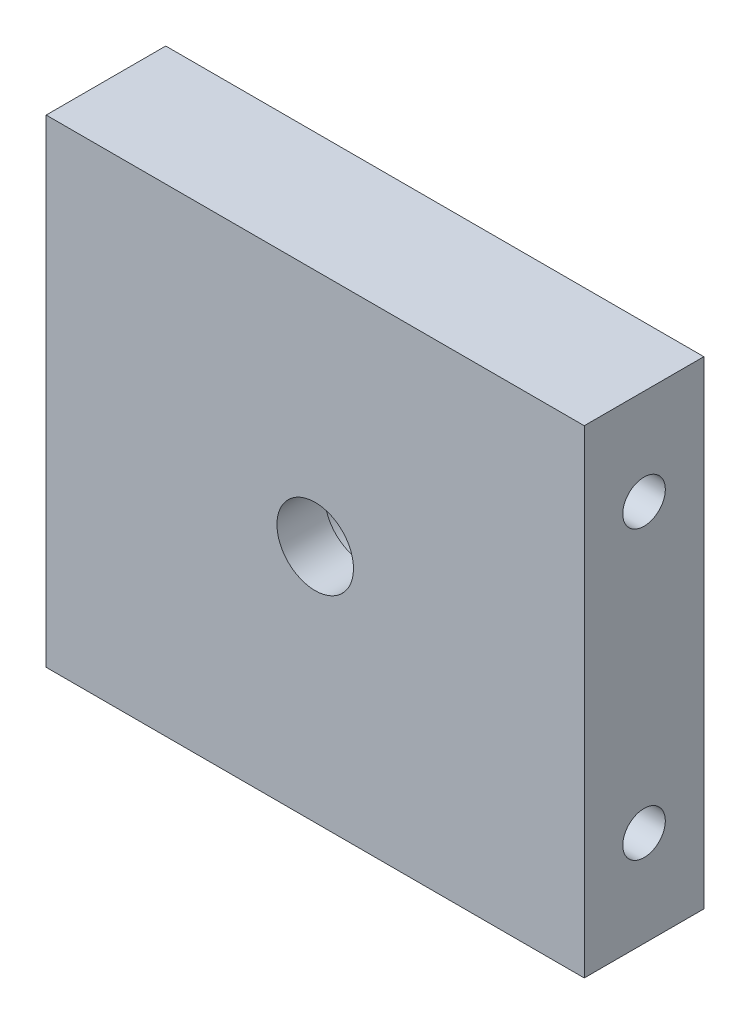
ISO-10303-21;
HEADER;
FILE_DESCRIPTION(('STEP AP214'),'2;1');
FILE_NAME('part.step','',(''),(''),'','','');
FILE_SCHEMA(('AUTOMOTIVE_DESIGN { 1 0 10303 214 1 1 1 1 }'));
ENDSEC;
DATA;
#1=APPLICATION_CONTEXT('core data for automotive mechanical design processes');
#2=APPLICATION_PROTOCOL_DEFINITION('international standard','automotive_design',2000,#1);
#3=PRODUCT_CONTEXT('',#1,'mechanical');
#4=PRODUCT('Part','Part','',(#3));
#5=PRODUCT_RELATED_PRODUCT_CATEGORY('part','',(#4));
#6=PRODUCT_DEFINITION_FORMATION('','',#4);
#7=PRODUCT_DEFINITION_CONTEXT('part definition',#1,'design');
#8=PRODUCT_DEFINITION('design','',#6,#7);
#9=PRODUCT_DEFINITION_SHAPE('','',#8);
#10=(LENGTH_UNIT() NAMED_UNIT(*) SI_UNIT(.MILLI.,.METRE.));
#11=(NAMED_UNIT(*) PLANE_ANGLE_UNIT() SI_UNIT($,.RADIAN.));
#12=(NAMED_UNIT(*) SI_UNIT($,.STERADIAN.) SOLID_ANGLE_UNIT());
#13=UNCERTAINTY_MEASURE_WITH_UNIT(LENGTH_MEASURE(1.E-05),#10,'distance_accuracy_value','');
#14=(GEOMETRIC_REPRESENTATION_CONTEXT(3) GLOBAL_UNCERTAINTY_ASSIGNED_CONTEXT((#13)) GLOBAL_UNIT_ASSIGNED_CONTEXT((#10,
#11,#12)) REPRESENTATION_CONTEXT('',''));
#15=CARTESIAN_POINT('',(0.,0.,0.));
#16=DIRECTION('',(0.,0.,1.));
#17=DIRECTION('',(1.,0.,0.));
#18=AXIS2_PLACEMENT_3D('',#15,#16,#17);
#19=CARTESIAN_POINT('',(14.2875,-12.7,6.35));
#20=DIRECTION('',(-1.,0.,0.));
#21=DIRECTION('',(0.,0.,1.));
#22=AXIS2_PLACEMENT_3D('',#19,#20,#21);
#23=PLANE('',#22);
#24=DIRECTION('',(0.,1.,0.));
#25=VECTOR('',#24,1.);
#26=CARTESIAN_POINT('',(14.2875,-12.7,0.));
#27=LINE('',#26,#25);
#28=CARTESIAN_POINT('',(14.2875,-12.7,0.));
#29=VERTEX_POINT('',#28);
#30=CARTESIAN_POINT('',(14.2875,12.7,0.));
#31=VERTEX_POINT('',#30);
#32=EDGE_CURVE('E132',#29,#31,#27,.T.);
#33=ORIENTED_EDGE('',*,*,#32,.T.);
#34=DIRECTION('',(0.,0.,-1.));
#35=VECTOR('',#34,1.);
#36=CARTESIAN_POINT('',(14.2875,12.7,6.35));
#37=LINE('',#36,#35);
#38=CARTESIAN_POINT('',(14.2875,12.7,6.35));
#39=VERTEX_POINT('',#38);
#40=EDGE_CURVE('E11',#39,#31,#37,.T.);
#41=ORIENTED_EDGE('',*,*,#40,.F.);
#42=DIRECTION('',(0.,1.,0.));
#43=VECTOR('',#42,1.);
#44=CARTESIAN_POINT('',(14.2875,-12.7,6.35));
#45=LINE('',#44,#43);
#46=CARTESIAN_POINT('',(14.2875,-12.7,6.35));
#47=VERTEX_POINT('',#46);
#48=EDGE_CURVE('E133',#47,#39,#45,.T.);
#49=ORIENTED_EDGE('',*,*,#48,.F.);
#50=DIRECTION('',(0.,0.,-1.));
#51=VECTOR('',#50,1.);
#52=CARTESIAN_POINT('',(14.2875,-12.7,6.35));
#53=LINE('',#52,#51);
#54=EDGE_CURVE('E139',#47,#29,#53,.T.);
#55=ORIENTED_EDGE('',*,*,#54,.T.);
#56=EDGE_LOOP('',(#33,#41,#49,#55));
#57=FACE_BOUND('',#56,.T.);
#58=CARTESIAN_POINT('',(14.2875,-7.62,3.175));
#59=DIRECTION('',(1.,0.,0.));
#60=DIRECTION('',(0.,0.,-1.));
#61=AXIS2_PLACEMENT_3D('',#58,#59,#60);
#62=CIRCLE('',#61,1.1303);
#63=CARTESIAN_POINT('',(14.2875,-7.62,2.0447));
#64=VERTEX_POINT('',#63);
#65=EDGE_CURVE('E126',#64,#64,#62,.T.);
#66=ORIENTED_EDGE('',*,*,#65,.F.);
#67=EDGE_LOOP('',(#66));
#68=FACE_BOUND('',#67,.T.);
#69=CARTESIAN_POINT('',(14.2875,7.62,3.175));
#70=DIRECTION('',(1.,0.,0.));
#71=DIRECTION('',(0.,0.,-1.));
#72=AXIS2_PLACEMENT_3D('',#69,#70,#71);
#73=CIRCLE('',#72,1.1303);
#74=CARTESIAN_POINT('',(14.2875,7.62,2.0447));
#75=VERTEX_POINT('',#74);
#76=EDGE_CURVE('E120',#75,#75,#73,.T.);
#77=ORIENTED_EDGE('',*,*,#76,.F.);
#78=EDGE_LOOP('',(#77));
#79=FACE_BOUND('',#78,.T.);
#80=ADVANCED_FACE('F37',(#57,#68,#79),#23,.F.);
#81=CARTESIAN_POINT('',(-14.2875,12.7,6.35));
#82=DIRECTION('',(0.,-1.,0.));
#83=DIRECTION('',(0.,0.,-1.));
#84=AXIS2_PLACEMENT_3D('',#81,#82,#83);
#85=PLANE('',#84);
#86=DIRECTION('',(-1.,0.,0.));
#87=VECTOR('',#86,1.);
#88=CARTESIAN_POINT('',(-14.2875,12.7,0.));
#89=LINE('',#88,#87);
#90=CARTESIAN_POINT('',(-14.2875,12.7,0.));
#91=VERTEX_POINT('',#90);
#92=EDGE_CURVE('E142',#31,#91,#89,.T.);
#93=ORIENTED_EDGE('',*,*,#92,.T.);
#94=DIRECTION('',(0.,0.,-1.));
#95=VECTOR('',#94,1.);
#96=CARTESIAN_POINT('',(-14.2875,12.7,6.35));
#97=LINE('',#96,#95);
#98=CARTESIAN_POINT('',(-14.2875,12.7,6.35));
#99=VERTEX_POINT('',#98);
#100=EDGE_CURVE('E45',#99,#91,#97,.T.);
#101=ORIENTED_EDGE('',*,*,#100,.F.);
#102=DIRECTION('',(-1.,0.,0.));
#103=VECTOR('',#102,1.);
#104=CARTESIAN_POINT('',(-14.2875,12.7,6.35));
#105=LINE('',#104,#103);
#106=EDGE_CURVE('E84',#39,#99,#105,.T.);
#107=ORIENTED_EDGE('',*,*,#106,.F.);
#108=ORIENTED_EDGE('',*,*,#40,.T.);
#109=EDGE_LOOP('',(#93,#101,#107,#108));
#110=FACE_BOUND('',#109,.T.);
#111=ADVANCED_FACE('F167',(#110),#85,.F.);
#112=CARTESIAN_POINT('',(-14.2875,-12.7,6.35));
#113=DIRECTION('',(1.,0.,0.));
#114=DIRECTION('',(0.,0.,-1.));
#115=AXIS2_PLACEMENT_3D('',#112,#113,#114);
#116=PLANE('',#115);
#117=CARTESIAN_POINT('',(-14.2875,7.62,3.175));
#118=DIRECTION('',(-1.,0.,0.));
#119=DIRECTION('',(0.,0.,1.));
#120=AXIS2_PLACEMENT_3D('',#117,#118,#119);
#121=CIRCLE('',#120,1.1303);
#122=CARTESIAN_POINT('',(-14.2875,7.62,4.3053));
#123=VERTEX_POINT('',#122);
#124=EDGE_CURVE('E108',#123,#123,#121,.T.);
#125=ORIENTED_EDGE('',*,*,#124,.F.);
#126=EDGE_LOOP('',(#125));
#127=FACE_BOUND('',#126,.T.);
#128=CARTESIAN_POINT('',(-14.2875,-7.62,3.175));
#129=DIRECTION('',(-1.,0.,0.));
#130=DIRECTION('',(0.,0.,1.));
#131=AXIS2_PLACEMENT_3D('',#128,#129,#130);
#132=CIRCLE('',#131,1.1303);
#133=CARTESIAN_POINT('',(-14.2875,-7.62,4.3053));
#134=VERTEX_POINT('',#133);
#135=EDGE_CURVE('E107',#134,#134,#132,.T.);
#136=ORIENTED_EDGE('',*,*,#135,.F.);
#137=EDGE_LOOP('',(#136));
#138=FACE_BOUND('',#137,.T.);
#139=DIRECTION('',(0.,-1.,0.));
#140=VECTOR('',#139,1.);
#141=CARTESIAN_POINT('',(-14.2875,-12.7,0.));
#142=LINE('',#141,#140);
#143=CARTESIAN_POINT('',(-14.2875,-12.7,0.));
#144=VERTEX_POINT('',#143);
#145=EDGE_CURVE('E71',#91,#144,#142,.T.);
#146=ORIENTED_EDGE('',*,*,#145,.T.);
#147=DIRECTION('',(0.,0.,-1.));
#148=VECTOR('',#147,1.);
#149=CARTESIAN_POINT('',(-14.2875,-12.7,6.35));
#150=LINE('',#149,#148);
#151=CARTESIAN_POINT('',(-14.2875,-12.7,6.35));
#152=VERTEX_POINT('',#151);
#153=EDGE_CURVE('E147',#152,#144,#150,.T.);
#154=ORIENTED_EDGE('',*,*,#153,.F.);
#155=DIRECTION('',(0.,-1.,0.));
#156=VECTOR('',#155,1.);
#157=CARTESIAN_POINT('',(-14.2875,-12.7,6.35));
#158=LINE('',#157,#156);
#159=EDGE_CURVE('E136',#99,#152,#158,.T.);
#160=ORIENTED_EDGE('',*,*,#159,.F.);
#161=ORIENTED_EDGE('',*,*,#100,.T.);
#162=EDGE_LOOP('',(#146,#154,#160,#161));
#163=FACE_BOUND('',#162,.T.);
#164=ADVANCED_FACE('F149',(#127,#138,#163),#116,.F.);
#165=CARTESIAN_POINT('',(-14.2875,-12.7,6.35));
#166=DIRECTION('',(0.,1.,0.));
#167=DIRECTION('',(0.,0.,1.));
#168=AXIS2_PLACEMENT_3D('',#165,#166,#167);
#169=PLANE('',#168);
#170=DIRECTION('',(1.,0.,0.));
#171=VECTOR('',#170,1.);
#172=CARTESIAN_POINT('',(-14.2875,-12.7,0.));
#173=LINE('',#172,#171);
#174=EDGE_CURVE('E77',#144,#29,#173,.T.);
#175=ORIENTED_EDGE('',*,*,#174,.T.);
#176=ORIENTED_EDGE('',*,*,#54,.F.);
#177=DIRECTION('',(1.,0.,0.));
#178=VECTOR('',#177,1.);
#179=CARTESIAN_POINT('',(-14.2875,-12.7,6.35));
#180=LINE('',#179,#178);
#181=EDGE_CURVE('E53',#152,#47,#180,.T.);
#182=ORIENTED_EDGE('',*,*,#181,.F.);
#183=ORIENTED_EDGE('',*,*,#153,.T.);
#184=EDGE_LOOP('',(#175,#176,#182,#183));
#185=FACE_BOUND('',#184,.T.);
#186=ADVANCED_FACE('F157',(#185),#169,.F.);
#187=CARTESIAN_POINT('',(0.,0.,6.35));
#188=DIRECTION('',(0.,0.,-1.));
#189=DIRECTION('',(-1.,0.,0.));
#190=AXIS2_PLACEMENT_3D('',#187,#188,#189);
#191=PLANE('',#190);
#192=CARTESIAN_POINT('',(0.,0.,6.35));
#193=DIRECTION('',(0.,0.,1.));
#194=DIRECTION('',(1.,0.,0.));
#195=AXIS2_PLACEMENT_3D('',#192,#193,#194);
#196=CIRCLE('',#195,2.032);
#197=CARTESIAN_POINT('',(2.032,0.,6.35));
#198=VERTEX_POINT('',#197);
#199=EDGE_CURVE('E114',#198,#198,#196,.T.);
#200=ORIENTED_EDGE('',*,*,#199,.F.);
#201=EDGE_LOOP('',(#200));
#202=FACE_BOUND('',#201,.T.);
#203=ORIENTED_EDGE('',*,*,#48,.T.);
#204=ORIENTED_EDGE('',*,*,#106,.T.);
#205=ORIENTED_EDGE('',*,*,#159,.T.);
#206=ORIENTED_EDGE('',*,*,#181,.T.);
#207=EDGE_LOOP('',(#203,#204,#205,#206));
#208=FACE_BOUND('',#207,.T.);
#209=ADVANCED_FACE('F159',(#202,#208),#191,.F.);
#210=CARTESIAN_POINT('',(0.,0.,0.));
#211=DIRECTION('',(0.,0.,-1.));
#212=DIRECTION('',(-1.,0.,0.));
#213=AXIS2_PLACEMENT_3D('',#210,#211,#212);
#214=PLANE('',#213);
#215=CARTESIAN_POINT('',(0.,0.,0.));
#216=DIRECTION('',(0.,0.,-1.));
#217=DIRECTION('',(-1.,0.,0.));
#218=AXIS2_PLACEMENT_3D('',#215,#216,#217);
#219=CIRCLE('',#218,3.048);
#220=CARTESIAN_POINT('',(-3.048,0.,0.));
#221=VERTEX_POINT('',#220);
#222=EDGE_CURVE('E338',#221,#221,#219,.T.);
#223=ORIENTED_EDGE('',*,*,#222,.F.);
#224=EDGE_LOOP('',(#223));
#225=FACE_BOUND('',#224,.T.);
#226=ORIENTED_EDGE('',*,*,#32,.F.);
#227=ORIENTED_EDGE('',*,*,#174,.F.);
#228=ORIENTED_EDGE('',*,*,#145,.F.);
#229=ORIENTED_EDGE('',*,*,#92,.F.);
#230=EDGE_LOOP('',(#226,#227,#228,#229));
#231=FACE_BOUND('',#230,.T.);
#232=ADVANCED_FACE('F152',(#225,#231),#214,.T.);
#233=CARTESIAN_POINT('',(6.6675,-7.62,3.175));
#234=DIRECTION('',(1.,0.,0.));
#235=DIRECTION('',(0.,0.,-1.));
#236=AXIS2_PLACEMENT_3D('',#233,#234,#235);
#237=CONICAL_SURFACE('',#236,1.1303,1.02974425867665);
#238=CARTESIAN_POINT('',(5.98834724231315,-7.62,3.175));
#239=VERTEX_POINT('',#238);
#240=VERTEX_LOOP('',#239);
#241=FACE_BOUND('',#240,.T.);
#242=CARTESIAN_POINT('',(6.6675,-7.62,3.175));
#243=DIRECTION('',(1.,0.,0.));
#244=DIRECTION('',(0.,0.,-1.));
#245=AXIS2_PLACEMENT_3D('',#242,#243,#244);
#246=CIRCLE('',#245,1.1303);
#247=CARTESIAN_POINT('',(6.6675,-7.62,2.0447));
#248=VERTEX_POINT('',#247);
#249=EDGE_CURVE('E129',#248,#248,#246,.T.);
#250=ORIENTED_EDGE('',*,*,#249,.T.);
#251=EDGE_LOOP('',(#250));
#252=FACE_BOUND('',#251,.T.);
#253=ADVANCED_FACE('F255',(#241,#252),#237,.F.);
#254=CARTESIAN_POINT('',(14.2875,-7.62,3.175));
#255=DIRECTION('',(1.,0.,0.));
#256=DIRECTION('',(0.,0.,-1.));
#257=AXIS2_PLACEMENT_3D('',#254,#255,#256);
#258=CYLINDRICAL_SURFACE('',#257,1.1303);
#259=ORIENTED_EDGE('',*,*,#249,.F.);
#260=EDGE_LOOP('',(#259));
#261=FACE_BOUND('',#260,.T.);
#262=ORIENTED_EDGE('',*,*,#65,.T.);
#263=EDGE_LOOP('',(#262));
#264=FACE_BOUND('',#263,.T.);
#265=ADVANCED_FACE('F286',(#261,#264),#258,.F.);
#266=CARTESIAN_POINT('',(6.6675,7.62,3.175));
#267=DIRECTION('',(1.,0.,0.));
#268=DIRECTION('',(0.,0.,-1.));
#269=AXIS2_PLACEMENT_3D('',#266,#267,#268);
#270=CONICAL_SURFACE('',#269,1.1303,1.02974425867665);
#271=CARTESIAN_POINT('',(5.98834724231315,7.62,3.175));
#272=VERTEX_POINT('',#271);
#273=VERTEX_LOOP('',#272);
#274=FACE_BOUND('',#273,.T.);
#275=CARTESIAN_POINT('',(6.6675,7.62,3.175));
#276=DIRECTION('',(1.,0.,0.));
#277=DIRECTION('',(0.,0.,-1.));
#278=AXIS2_PLACEMENT_3D('',#275,#276,#277);
#279=CIRCLE('',#278,1.1303);
#280=CARTESIAN_POINT('',(6.6675,7.62,2.0447));
#281=VERTEX_POINT('',#280);
#282=EDGE_CURVE('E123',#281,#281,#279,.T.);
#283=ORIENTED_EDGE('',*,*,#282,.T.);
#284=EDGE_LOOP('',(#283));
#285=FACE_BOUND('',#284,.T.);
#286=ADVANCED_FACE('F282',(#274,#285),#270,.F.);
#287=CARTESIAN_POINT('',(14.2875,7.62,3.175));
#288=DIRECTION('',(1.,0.,0.));
#289=DIRECTION('',(0.,0.,-1.));
#290=AXIS2_PLACEMENT_3D('',#287,#288,#289);
#291=CYLINDRICAL_SURFACE('',#290,1.1303);
#292=ORIENTED_EDGE('',*,*,#282,.F.);
#293=EDGE_LOOP('',(#292));
#294=FACE_BOUND('',#293,.T.);
#295=ORIENTED_EDGE('',*,*,#76,.T.);
#296=EDGE_LOOP('',(#295));
#297=FACE_BOUND('',#296,.T.);
#298=ADVANCED_FACE('F188',(#294,#297),#291,.F.);
#299=CARTESIAN_POINT('',(-6.6675,-7.62,3.175));
#300=DIRECTION('',(-1.,0.,0.));
#301=DIRECTION('',(0.,0.,1.));
#302=AXIS2_PLACEMENT_3D('',#299,#300,#301);
#303=CONICAL_SURFACE('',#302,1.1303,1.02974425867665);
#304=CARTESIAN_POINT('',(-5.98834724231315,-7.62,3.175));
#305=VERTEX_POINT('',#304);
#306=VERTEX_LOOP('',#305);
#307=FACE_BOUND('',#306,.T.);
#308=CARTESIAN_POINT('',(-6.6675,-7.62,3.175));
#309=DIRECTION('',(-1.,0.,0.));
#310=DIRECTION('',(0.,0.,1.));
#311=AXIS2_PLACEMENT_3D('',#308,#309,#310);
#312=CIRCLE('',#311,1.1303);
#313=CARTESIAN_POINT('',(-6.6675,-7.62,4.3053));
#314=VERTEX_POINT('',#313);
#315=EDGE_CURVE('E111',#314,#314,#312,.T.);
#316=ORIENTED_EDGE('',*,*,#315,.T.);
#317=EDGE_LOOP('',(#316));
#318=FACE_BOUND('',#317,.T.);
#319=ADVANCED_FACE('F193',(#307,#318),#303,.F.);
#320=CARTESIAN_POINT('',(-14.2875,-7.62,3.175));
#321=DIRECTION('',(-1.,0.,0.));
#322=DIRECTION('',(0.,0.,1.));
#323=AXIS2_PLACEMENT_3D('',#320,#321,#322);
#324=CYLINDRICAL_SURFACE('',#323,1.1303);
#325=ORIENTED_EDGE('',*,*,#315,.F.);
#326=EDGE_LOOP('',(#325));
#327=FACE_BOUND('',#326,.T.);
#328=ORIENTED_EDGE('',*,*,#135,.T.);
#329=EDGE_LOOP('',(#328));
#330=FACE_BOUND('',#329,.T.);
#331=ADVANCED_FACE('F101',(#327,#330),#324,.F.);
#332=CARTESIAN_POINT('',(-6.6675,7.62,3.175));
#333=DIRECTION('',(-1.,0.,0.));
#334=DIRECTION('',(0.,0.,1.));
#335=AXIS2_PLACEMENT_3D('',#332,#333,#334);
#336=CONICAL_SURFACE('',#335,1.1303,1.02974425867665);
#337=CARTESIAN_POINT('',(-5.98834724231315,7.62,3.175));
#338=VERTEX_POINT('',#337);
#339=VERTEX_LOOP('',#338);
#340=FACE_BOUND('',#339,.T.);
#341=CARTESIAN_POINT('',(-6.6675,7.62,3.175));
#342=DIRECTION('',(-1.,0.,0.));
#343=DIRECTION('',(0.,0.,1.));
#344=AXIS2_PLACEMENT_3D('',#341,#342,#343);
#345=CIRCLE('',#344,1.1303);
#346=CARTESIAN_POINT('',(-6.6675,7.62,4.3053));
#347=VERTEX_POINT('',#346);
#348=EDGE_CURVE('E105',#347,#347,#345,.T.);
#349=ORIENTED_EDGE('',*,*,#348,.T.);
#350=EDGE_LOOP('',(#349));
#351=FACE_BOUND('',#350,.T.);
#352=ADVANCED_FACE('F97',(#340,#351),#336,.F.);
#353=CARTESIAN_POINT('',(-14.2875,7.62,3.175));
#354=DIRECTION('',(-1.,0.,0.));
#355=DIRECTION('',(0.,0.,1.));
#356=AXIS2_PLACEMENT_3D('',#353,#354,#355);
#357=CYLINDRICAL_SURFACE('',#356,1.1303);
#358=ORIENTED_EDGE('',*,*,#348,.F.);
#359=EDGE_LOOP('',(#358));
#360=FACE_BOUND('',#359,.T.);
#361=ORIENTED_EDGE('',*,*,#124,.T.);
#362=EDGE_LOOP('',(#361));
#363=FACE_BOUND('',#362,.T.);
#364=ADVANCED_FACE('F100',(#360,#363),#357,.F.);
#365=CARTESIAN_POINT('',(0.,0.,3.81));
#366=DIRECTION('',(0.,0.,1.));
#367=DIRECTION('',(1.,0.,0.));
#368=AXIS2_PLACEMENT_3D('',#365,#366,#367);
#369=CYLINDRICAL_SURFACE('',#368,2.032);
#370=CARTESIAN_POINT('',(0.,0.,3.81));
#371=DIRECTION('',(0.,0.,1.));
#372=DIRECTION('',(1.,0.,0.));
#373=AXIS2_PLACEMENT_3D('',#370,#371,#372);
#374=CIRCLE('',#373,2.032);
#375=CARTESIAN_POINT('',(2.032,0.,3.81));
#376=VERTEX_POINT('',#375);
#377=EDGE_CURVE('E342',#376,#376,#374,.F.);
#378=ORIENTED_EDGE('',*,*,#377,.T.);
#379=EDGE_LOOP('',(#378));
#380=FACE_BOUND('',#379,.T.);
#381=ORIENTED_EDGE('',*,*,#199,.T.);
#382=EDGE_LOOP('',(#381));
#383=FACE_BOUND('',#382,.T.);
#384=ADVANCED_FACE('F227',(#380,#383),#369,.F.);
#385=CARTESIAN_POINT('',(0.,0.,3.81));
#386=DIRECTION('',(0.,0.,1.));
#387=DIRECTION('',(1.,0.,0.));
#388=AXIS2_PLACEMENT_3D('',#385,#386,#387);
#389=PLANE('',#388);
#390=CARTESIAN_POINT('',(0.,0.,3.81));
#391=DIRECTION('',(0.,0.,1.));
#392=DIRECTION('',(1.,0.,0.));
#393=AXIS2_PLACEMENT_3D('',#390,#391,#392);
#394=CIRCLE('',#393,3.048);
#395=CARTESIAN_POINT('',(-3.048,0.,3.81));
#396=VERTEX_POINT('',#395);
#397=EDGE_CURVE('E341',#396,#396,#394,.F.);
#398=ORIENTED_EDGE('',*,*,#397,.T.);
#399=EDGE_LOOP('',(#398));
#400=FACE_BOUND('',#399,.T.);
#401=ORIENTED_EDGE('',*,*,#377,.F.);
#402=EDGE_LOOP('',(#401));
#403=FACE_BOUND('',#402,.T.);
#404=ADVANCED_FACE('F245',(#400,#403),#389,.F.);
#405=CARTESIAN_POINT('',(0.,0.,12.4310458762264));
#406=DIRECTION('',(0.,0.,-1.));
#407=DIRECTION('',(-1.,0.,0.));
#408=AXIS2_PLACEMENT_3D('',#405,#406,#407);
#409=CYLINDRICAL_SURFACE('',#408,3.048);
#410=CARTESIAN_POINT('',(-3.048,0.,0.));
#411=CARTESIAN_POINT('',(-3.048,0.,0.0396874999999998));
#412=CARTESIAN_POINT('',(-3.048,0.,0.0793749999999996));
#413=CARTESIAN_POINT('',(-3.048,0.,0.15875));
#414=CARTESIAN_POINT('',(-3.048,0.,0.1984375));
#415=CARTESIAN_POINT('',(-3.048,0.,0.2778125));
#416=CARTESIAN_POINT('',(-3.048,0.,0.3175));
#417=CARTESIAN_POINT('',(-3.048,0.,0.396875));
#418=CARTESIAN_POINT('',(-3.048,0.,0.436562499999999));
#419=CARTESIAN_POINT('',(-3.048,0.,0.5159375));
#420=CARTESIAN_POINT('',(-3.048,0.,0.555625));
#421=CARTESIAN_POINT('',(-3.048,0.,0.635));
#422=CARTESIAN_POINT('',(-3.048,0.,0.6746875));
#423=CARTESIAN_POINT('',(-3.048,0.,0.7540625));
#424=CARTESIAN_POINT('',(-3.048,0.,0.793749999999999));
#425=CARTESIAN_POINT('',(-3.048,0.,0.873124999999999));
#426=CARTESIAN_POINT('',(-3.048,0.,0.912812499999999));
#427=CARTESIAN_POINT('',(-3.048,0.,0.992187499999999));
#428=CARTESIAN_POINT('',(-3.048,0.,1.031875));
#429=CARTESIAN_POINT('',(-3.048,0.,1.11125));
#430=CARTESIAN_POINT('',(-3.048,0.,1.1509375));
#431=CARTESIAN_POINT('',(-3.048,0.,1.2303125));
#432=CARTESIAN_POINT('',(-3.048,0.,1.27));
#433=CARTESIAN_POINT('',(-3.048,0.,1.349375));
#434=CARTESIAN_POINT('',(-3.048,0.,1.3890625));
#435=CARTESIAN_POINT('',(-3.048,0.,1.4684375));
#436=CARTESIAN_POINT('',(-3.048,0.,1.508125));
#437=CARTESIAN_POINT('',(-3.048,0.,1.5875));
#438=CARTESIAN_POINT('',(-3.048,0.,1.6271875));
#439=CARTESIAN_POINT('',(-3.048,0.,1.7065625));
#440=CARTESIAN_POINT('',(-3.048,0.,1.74625));
#441=CARTESIAN_POINT('',(-3.048,0.,1.825625));
#442=CARTESIAN_POINT('',(-3.048,0.,1.8653125));
#443=CARTESIAN_POINT('',(-3.048,0.,1.9446875));
#444=CARTESIAN_POINT('',(-3.048,0.,1.984375));
#445=CARTESIAN_POINT('',(-3.048,0.,2.06375));
#446=CARTESIAN_POINT('',(-3.048,0.,2.1034375));
#447=CARTESIAN_POINT('',(-3.048,0.,2.1828125));
#448=CARTESIAN_POINT('',(-3.048,0.,2.2225));
#449=CARTESIAN_POINT('',(-3.048,0.,2.301875));
#450=CARTESIAN_POINT('',(-3.048,0.,2.3415625));
#451=CARTESIAN_POINT('',(-3.048,0.,2.4209375));
#452=CARTESIAN_POINT('',(-3.048,0.,2.460625));
#453=CARTESIAN_POINT('',(-3.048,0.,2.54));
#454=CARTESIAN_POINT('',(-3.048,0.,2.5796875));
#455=CARTESIAN_POINT('',(-3.048,0.,2.6590625));
#456=CARTESIAN_POINT('',(-3.048,0.,2.69875));
#457=CARTESIAN_POINT('',(-3.048,0.,2.778125));
#458=CARTESIAN_POINT('',(-3.048,0.,2.8178125));
#459=CARTESIAN_POINT('',(-3.048,0.,2.8971875));
#460=CARTESIAN_POINT('',(-3.048,0.,2.936875));
#461=CARTESIAN_POINT('',(-3.048,0.,3.01625));
#462=CARTESIAN_POINT('',(-3.048,0.,3.0559375));
#463=CARTESIAN_POINT('',(-3.048,0.,3.1353125));
#464=CARTESIAN_POINT('',(-3.048,0.,3.175));
#465=CARTESIAN_POINT('',(-3.048,0.,3.254375));
#466=CARTESIAN_POINT('',(-3.048,0.,3.2940625));
#467=CARTESIAN_POINT('',(-3.048,0.,3.3734375));
#468=CARTESIAN_POINT('',(-3.048,0.,3.413125));
#469=CARTESIAN_POINT('',(-3.048,0.,3.4925));
#470=CARTESIAN_POINT('',(-3.048,0.,3.5321875));
#471=CARTESIAN_POINT('',(-3.048,0.,3.6115625));
#472=CARTESIAN_POINT('',(-3.048,0.,3.65125));
#473=CARTESIAN_POINT('',(-3.048,0.,3.730625));
#474=CARTESIAN_POINT('',(-3.048,0.,3.7703125));
#475=CARTESIAN_POINT('',(-3.048,0.,3.81));
#476=B_SPLINE_CURVE_WITH_KNOTS('',3,(#410,#411,#412,#413,#414,#415,#416,#417,#418,#419,#420,
#421,#422,#423,#424,#425,#426,#427,#428,#429,#430,#431,#432,#433,#434,#435,#436,#437,#438,#439,
#440,#441,#442,#443,#444,#445,#446,#447,#448,#449,#450,#451,#452,#453,#454,#455,#456,#457,#458,
#459,#460,#461,#462,#463,#464,#465,#466,#467,#468,#469,#470,#471,#472,#473,#474,#475),
.UNSPECIFIED.,.F.,.F.,(4,2,2,2,2,2,2,2,2,2,2,2,2,2,2,2,2,2,2,2,2,2,2,2,2,2,2,2,2,2,2,2,4),(0.,
0.119062499999999,0.238125,0.3571875,0.476249999999999,0.5953125,0.714375,0.833437499999999,
0.952499999999998,1.0715625,1.190625,1.3096875,1.42875,1.5478125,1.666875,1.7859375,1.905,
2.0240625,2.143125,2.2621875,2.38125,2.5003125,2.619375,2.7384375,2.8575,2.9765625,3.095625,
3.2146875,3.33375,3.4528125,3.571875,3.6909375,3.81),.UNSPECIFIED.);
#477=EDGE_CURVE('BSEAM264',#221,#396,#476,.T.);
#478=ORIENTED_EDGE('',*,*,#222,.T.);
#479=ORIENTED_EDGE('',*,*,#397,.F.);
#480=ORIENTED_EDGE('',*,*,#477,.T.);
#481=ORIENTED_EDGE('',*,*,#477,.F.);
#482=EDGE_LOOP('',(#478,#480,#479,#481));
#483=FACE_BOUND('',#482,.T.);
#484=ADVANCED_FACE('F264',(#483),#409,.F.);
#485=CLOSED_SHELL('',(#80,#111,#164,#186,#209,#232,#253,#265,#286,#298,#319,#331,#352,#364,#384,
#404,#484));
#486=MANIFOLD_SOLID_BREP('B2',#485);
#487=ADVANCED_BREP_SHAPE_REPRESENTATION('',(#18,#486),#14);
#488=SHAPE_DEFINITION_REPRESENTATION(#9,#487);
ENDSEC;
END-ISO-10303-21;
